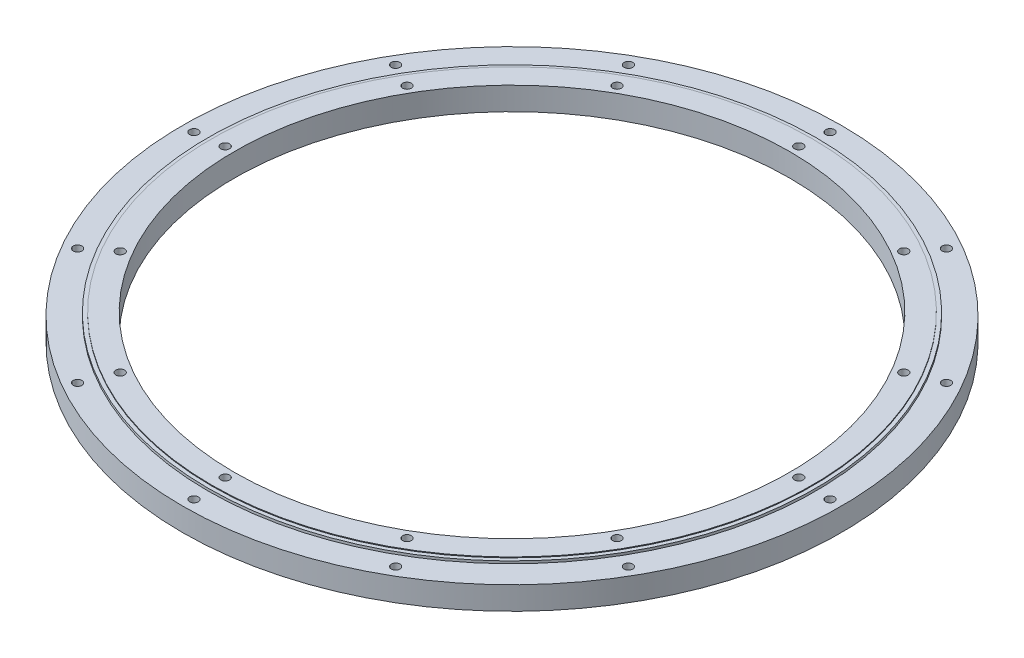
ISO-10303-21;
HEADER;
FILE_DESCRIPTION(('STEP AP214'),'2;1');
FILE_NAME('part.step','',(''),(''),'','','');
FILE_SCHEMA(('AUTOMOTIVE_DESIGN { 1 0 10303 214 1 1 1 1 }'));
ENDSEC;
DATA;
#1=APPLICATION_CONTEXT('core data for automotive mechanical design processes');
#2=APPLICATION_PROTOCOL_DEFINITION('international standard','automotive_design',2000,#1);
#3=PRODUCT_CONTEXT('',#1,'mechanical');
#4=PRODUCT('Part','Part','',(#3));
#5=PRODUCT_RELATED_PRODUCT_CATEGORY('part','',(#4));
#6=PRODUCT_DEFINITION_FORMATION('','',#4);
#7=PRODUCT_DEFINITION_CONTEXT('part definition',#1,'design');
#8=PRODUCT_DEFINITION('design','',#6,#7);
#9=PRODUCT_DEFINITION_SHAPE('','',#8);
#10=(LENGTH_UNIT() NAMED_UNIT(*) SI_UNIT(.MILLI.,.METRE.));
#11=(NAMED_UNIT(*) PLANE_ANGLE_UNIT() SI_UNIT($,.RADIAN.));
#12=(NAMED_UNIT(*) SI_UNIT($,.STERADIAN.) SOLID_ANGLE_UNIT());
#13=UNCERTAINTY_MEASURE_WITH_UNIT(LENGTH_MEASURE(1.E-05),#10,'distance_accuracy_value','');
#14=(GEOMETRIC_REPRESENTATION_CONTEXT(3) GLOBAL_UNCERTAINTY_ASSIGNED_CONTEXT((#13)) GLOBAL_UNIT_ASSIGNED_CONTEXT((#10,
#11,#12)) REPRESENTATION_CONTEXT('',''));
#15=CARTESIAN_POINT('',(0.,0.,0.));
#16=DIRECTION('',(0.,0.,1.));
#17=DIRECTION('',(1.,0.,0.));
#18=AXIS2_PLACEMENT_3D('',#15,#16,#17);
#19=CARTESIAN_POINT('',(-169.,2.,0.));
#20=DIRECTION('',(0.,1.,0.));
#21=DIRECTION('',(0.,0.,1.));
#22=AXIS2_PLACEMENT_3D('',#19,#20,#21);
#23=PLANE('',#22);
#24=CARTESIAN_POINT('',(87.2499999999999,2.,-151.121432960385));
#25=DIRECTION('',(0.,-1.,0.));
#26=DIRECTION('',(0.,0.,-1.));
#27=AXIS2_PLACEMENT_3D('',#24,#25,#26);
#28=CIRCLE('',#27,2.65000000000001);
#29=CARTESIAN_POINT('',(87.2499999999999,2.,-153.771432960385));
#30=VERTEX_POINT('',#29);
#31=EDGE_CURVE('E262',#30,#30,#28,.F.);
#32=ORIENTED_EDGE('',*,*,#31,.T.);
#33=EDGE_LOOP('',(#32));
#34=FACE_BOUND('',#33,.T.);
#35=CARTESIAN_POINT('',(151.121432960385,2.,87.2499999999999));
#36=DIRECTION('',(0.,-1.,0.));
#37=DIRECTION('',(0.,0.,-1.));
#38=AXIS2_PLACEMENT_3D('',#35,#36,#37);
#39=CIRCLE('',#38,2.64999999999999);
#40=CARTESIAN_POINT('',(151.121432960385,2.,84.6));
#41=VERTEX_POINT('',#40);
#42=EDGE_CURVE('E219',#41,#41,#39,.F.);
#43=ORIENTED_EDGE('',*,*,#42,.T.);
#44=EDGE_LOOP('',(#43));
#45=FACE_BOUND('',#44,.T.);
#46=CARTESIAN_POINT('',(0.,2.,0.));
#47=DIRECTION('',(0.,-1.,0.));
#48=DIRECTION('',(0.,0.,-1.));
#49=AXIS2_PLACEMENT_3D('',#46,#47,#48);
#50=CIRCLE('',#49,182.589);
#51=CARTESIAN_POINT('',(0.,2.,-182.589));
#52=VERTEX_POINT('',#51);
#53=EDGE_CURVE('E25',#52,#52,#50,.T.);
#54=ORIENTED_EDGE('',*,*,#53,.T.);
#55=EDGE_LOOP('',(#54));
#56=FACE_BOUND('',#55,.T.);
#57=CARTESIAN_POINT('',(0.,2.,0.));
#58=DIRECTION('',(0.,-1.,0.));
#59=DIRECTION('',(0.,0.,-1.));
#60=AXIS2_PLACEMENT_3D('',#57,#58,#59);
#61=CIRCLE('',#60,169.);
#62=CARTESIAN_POINT('',(0.,2.,-169.));
#63=VERTEX_POINT('',#62);
#64=EDGE_CURVE('E215',#63,#63,#61,.F.);
#65=ORIENTED_EDGE('',*,*,#64,.T.);
#66=EDGE_LOOP('',(#65));
#67=FACE_BOUND('',#66,.T.);
#68=CARTESIAN_POINT('',(87.2500000000001,2.,151.121432960384));
#69=DIRECTION('',(0.,-1.,0.));
#70=DIRECTION('',(0.,0.,-1.));
#71=AXIS2_PLACEMENT_3D('',#68,#69,#70);
#72=CIRCLE('',#71,2.64999999999999);
#73=CARTESIAN_POINT('',(87.2500000000001,2.,148.471432960385));
#74=VERTEX_POINT('',#73);
#75=EDGE_CURVE('E223',#74,#74,#72,.F.);
#76=ORIENTED_EDGE('',*,*,#75,.T.);
#77=EDGE_LOOP('',(#76));
#78=FACE_BOUND('',#77,.T.);
#79=CARTESIAN_POINT('',(1.0953667407042E-13,2.,174.5));
#80=DIRECTION('',(0.,-1.,0.));
#81=DIRECTION('',(0.,0.,-1.));
#82=AXIS2_PLACEMENT_3D('',#79,#80,#81);
#83=CIRCLE('',#82,2.64999999999999);
#84=CARTESIAN_POINT('',(1.0953667407042E-13,2.,171.85));
#85=VERTEX_POINT('',#84);
#86=EDGE_CURVE('E227',#85,#85,#83,.F.);
#87=ORIENTED_EDGE('',*,*,#86,.T.);
#88=EDGE_LOOP('',(#87));
#89=FACE_BOUND('',#88,.T.);
#90=CARTESIAN_POINT('',(-87.2499999999999,2.,151.121432960385));
#91=DIRECTION('',(0.,-1.,0.));
#92=DIRECTION('',(0.,0.,-1.));
#93=AXIS2_PLACEMENT_3D('',#90,#91,#92);
#94=CIRCLE('',#93,2.65000000000001);
#95=CARTESIAN_POINT('',(-87.2499999999999,2.,148.471432960385));
#96=VERTEX_POINT('',#95);
#97=EDGE_CURVE('E231',#96,#96,#94,.F.);
#98=ORIENTED_EDGE('',*,*,#97,.T.);
#99=EDGE_LOOP('',(#98));
#100=FACE_BOUND('',#99,.T.);
#101=CARTESIAN_POINT('',(-151.121432960384,2.,87.2500000000001));
#102=DIRECTION('',(0.,-1.,0.));
#103=DIRECTION('',(0.,0.,-1.));
#104=AXIS2_PLACEMENT_3D('',#101,#102,#103);
#105=CIRCLE('',#104,2.64999999999999);
#106=CARTESIAN_POINT('',(-151.121432960384,2.,84.6000000000002));
#107=VERTEX_POINT('',#106);
#108=EDGE_CURVE('E235',#107,#107,#105,.F.);
#109=ORIENTED_EDGE('',*,*,#108,.T.);
#110=EDGE_LOOP('',(#109));
#111=FACE_BOUND('',#110,.T.);
#112=CARTESIAN_POINT('',(-174.5,2.,1.77190889633515E-13));
#113=DIRECTION('',(0.,-1.,0.));
#114=DIRECTION('',(0.,0.,-1.));
#115=AXIS2_PLACEMENT_3D('',#112,#113,#114);
#116=CIRCLE('',#115,2.64999999999999);
#117=CARTESIAN_POINT('',(-174.5,2.,-2.64999999999981));
#118=VERTEX_POINT('',#117);
#119=EDGE_CURVE('E239',#118,#118,#116,.F.);
#120=ORIENTED_EDGE('',*,*,#119,.T.);
#121=EDGE_LOOP('',(#120));
#122=FACE_BOUND('',#121,.T.);
#123=CARTESIAN_POINT('',(174.5,2.,0.));
#124=DIRECTION('',(0.,-1.,0.));
#125=DIRECTION('',(0.,0.,-1.));
#126=AXIS2_PLACEMENT_3D('',#123,#124,#125);
#127=CIRCLE('',#126,2.64999999999999);
#128=CARTESIAN_POINT('',(174.5,2.,-2.65000000000003));
#129=VERTEX_POINT('',#128);
#130=EDGE_CURVE('E243',#129,#129,#127,.F.);
#131=ORIENTED_EDGE('',*,*,#130,.T.);
#132=EDGE_LOOP('',(#131));
#133=FACE_BOUND('',#132,.T.);
#134=CARTESIAN_POINT('',(0.,2.,-174.5));
#135=DIRECTION('',(0.,-1.,0.));
#136=DIRECTION('',(0.,0.,-1.));
#137=AXIS2_PLACEMENT_3D('',#134,#135,#136);
#138=CIRCLE('',#137,2.64999999999999);
#139=CARTESIAN_POINT('',(0.,2.,-177.15));
#140=VERTEX_POINT('',#139);
#141=EDGE_CURVE('E247',#140,#140,#138,.F.);
#142=ORIENTED_EDGE('',*,*,#141,.T.);
#143=EDGE_LOOP('',(#142));
#144=FACE_BOUND('',#143,.T.);
#145=CARTESIAN_POINT('',(-87.2499999999998,2.,-151.121432960385));
#146=DIRECTION('',(0.,-1.,0.));
#147=DIRECTION('',(0.,0.,-1.));
#148=AXIS2_PLACEMENT_3D('',#145,#146,#147);
#149=CIRCLE('',#148,2.65000000000001);
#150=CARTESIAN_POINT('',(-87.2499999999998,2.,-153.771432960385));
#151=VERTEX_POINT('',#150);
#152=EDGE_CURVE('E251',#151,#151,#149,.F.);
#153=ORIENTED_EDGE('',*,*,#152,.T.);
#154=EDGE_LOOP('',(#153));
#155=FACE_BOUND('',#154,.T.);
#156=CARTESIAN_POINT('',(151.121432960385,2.,-87.25));
#157=DIRECTION('',(0.,-1.,0.));
#158=DIRECTION('',(0.,0.,-1.));
#159=AXIS2_PLACEMENT_3D('',#156,#157,#158);
#160=CIRCLE('',#159,2.64999999999999);
#161=CARTESIAN_POINT('',(151.121432960385,2.,-89.9));
#162=VERTEX_POINT('',#161);
#163=EDGE_CURVE('E255',#162,#162,#160,.F.);
#164=ORIENTED_EDGE('',*,*,#163,.T.);
#165=EDGE_LOOP('',(#164));
#166=FACE_BOUND('',#165,.T.);
#167=CARTESIAN_POINT('',(-151.121432960385,2.,-87.25));
#168=DIRECTION('',(0.,-1.,0.));
#169=DIRECTION('',(0.,0.,-1.));
#170=AXIS2_PLACEMENT_3D('',#167,#168,#169);
#171=CIRCLE('',#170,2.64999999999999);
#172=CARTESIAN_POINT('',(-151.121432960385,2.,-89.8999999999999));
#173=VERTEX_POINT('',#172);
#174=EDGE_CURVE('E259',#173,#173,#171,.F.);
#175=ORIENTED_EDGE('',*,*,#174,.T.);
#176=EDGE_LOOP('',(#175));
#177=FACE_BOUND('',#176,.T.);
#178=ADVANCED_FACE('F22',(#34,#45,#56,#67,#78,#89,#100,#111,#122,#133,#144,#155,#166,#177),#23,.F.);
#179=CARTESIAN_POINT('',(0.,0.,0.));
#180=DIRECTION('',(0.,-1.,0.));
#181=DIRECTION('',(0.,0.,-1.));
#182=AXIS2_PLACEMENT_3D('',#179,#180,#181);
#183=CYLINDRICAL_SURFACE('',#182,182.589);
#184=ORIENTED_EDGE('',*,*,#53,.F.);
#185=EDGE_LOOP('',(#184));
#186=FACE_BOUND('',#185,.T.);
#187=CARTESIAN_POINT('',(0.,0.76,0.));
#188=DIRECTION('',(0.,-1.,0.));
#189=DIRECTION('',(0.,0.,-1.));
#190=AXIS2_PLACEMENT_3D('',#187,#188,#189);
#191=CIRCLE('',#190,182.589);
#192=CARTESIAN_POINT('',(0.,0.76,-182.589));
#193=VERTEX_POINT('',#192);
#194=EDGE_CURVE('E211',#193,#193,#191,.T.);
#195=ORIENTED_EDGE('',*,*,#194,.T.);
#196=EDGE_LOOP('',(#195));
#197=FACE_BOUND('',#196,.T.);
#198=ADVANCED_FACE('F273',(#186,#197),#183,.F.);
#199=CARTESIAN_POINT('',(87.2499999999999,2.,-151.121432960385));
#200=DIRECTION('',(0.,-1.,0.));
#201=DIRECTION('',(0.,0.,-1.));
#202=AXIS2_PLACEMENT_3D('',#199,#200,#201);
#203=CYLINDRICAL_SURFACE('',#202,2.65000000000001);
#204=CARTESIAN_POINT('',(87.2499999999999,16.,-151.121432960385));
#205=DIRECTION('',(0.,-1.,0.));
#206=DIRECTION('',(0.,0.,-1.));
#207=AXIS2_PLACEMENT_3D('',#204,#205,#206);
#208=CIRCLE('',#207,2.65000000000001);
#209=CARTESIAN_POINT('',(87.2499999999999,16.,-153.771432960385));
#210=VERTEX_POINT('',#209);
#211=EDGE_CURVE('E207',#210,#210,#208,.F.);
#212=ORIENTED_EDGE('',*,*,#211,.T.);
#213=EDGE_LOOP('',(#212));
#214=FACE_BOUND('',#213,.T.);
#215=ORIENTED_EDGE('',*,*,#31,.F.);
#216=EDGE_LOOP('',(#215));
#217=FACE_BOUND('',#216,.T.);
#218=ADVANCED_FACE('F276',(#214,#217),#203,.F.);
#219=CARTESIAN_POINT('',(-151.121432960385,2.,-87.25));
#220=DIRECTION('',(0.,-1.,0.));
#221=DIRECTION('',(0.,0.,-1.));
#222=AXIS2_PLACEMENT_3D('',#219,#220,#221);
#223=CYLINDRICAL_SURFACE('',#222,2.64999999999999);
#224=CARTESIAN_POINT('',(-151.121432960385,16.,-87.25));
#225=DIRECTION('',(0.,-1.,0.));
#226=DIRECTION('',(0.,0.,-1.));
#227=AXIS2_PLACEMENT_3D('',#224,#225,#226);
#228=CIRCLE('',#227,2.64999999999999);
#229=CARTESIAN_POINT('',(-151.121432960385,16.,-89.8999999999999));
#230=VERTEX_POINT('',#229);
#231=EDGE_CURVE('E203',#230,#230,#228,.F.);
#232=ORIENTED_EDGE('',*,*,#231,.T.);
#233=EDGE_LOOP('',(#232));
#234=FACE_BOUND('',#233,.T.);
#235=ORIENTED_EDGE('',*,*,#174,.F.);
#236=EDGE_LOOP('',(#235));
#237=FACE_BOUND('',#236,.T.);
#238=ADVANCED_FACE('F416',(#234,#237),#223,.F.);
#239=CARTESIAN_POINT('',(151.121432960385,2.,-87.25));
#240=DIRECTION('',(0.,-1.,0.));
#241=DIRECTION('',(0.,0.,-1.));
#242=AXIS2_PLACEMENT_3D('',#239,#240,#241);
#243=CYLINDRICAL_SURFACE('',#242,2.64999999999999);
#244=CARTESIAN_POINT('',(151.121432960385,16.,-87.25));
#245=DIRECTION('',(0.,-1.,0.));
#246=DIRECTION('',(0.,0.,-1.));
#247=AXIS2_PLACEMENT_3D('',#244,#245,#246);
#248=CIRCLE('',#247,2.64999999999999);
#249=CARTESIAN_POINT('',(151.121432960385,16.,-89.9));
#250=VERTEX_POINT('',#249);
#251=EDGE_CURVE('E199',#250,#250,#248,.F.);
#252=ORIENTED_EDGE('',*,*,#251,.T.);
#253=EDGE_LOOP('',(#252));
#254=FACE_BOUND('',#253,.T.);
#255=ORIENTED_EDGE('',*,*,#163,.F.);
#256=EDGE_LOOP('',(#255));
#257=FACE_BOUND('',#256,.T.);
#258=ADVANCED_FACE('F412',(#254,#257),#243,.F.);
#259=CARTESIAN_POINT('',(-87.2499999999998,2.,-151.121432960385));
#260=DIRECTION('',(0.,-1.,0.));
#261=DIRECTION('',(0.,0.,-1.));
#262=AXIS2_PLACEMENT_3D('',#259,#260,#261);
#263=CYLINDRICAL_SURFACE('',#262,2.65000000000001);
#264=CARTESIAN_POINT('',(-87.2499999999998,16.,-151.121432960385));
#265=DIRECTION('',(0.,-1.,0.));
#266=DIRECTION('',(0.,0.,-1.));
#267=AXIS2_PLACEMENT_3D('',#264,#265,#266);
#268=CIRCLE('',#267,2.65000000000001);
#269=CARTESIAN_POINT('',(-87.2499999999998,16.,-153.771432960385));
#270=VERTEX_POINT('',#269);
#271=EDGE_CURVE('E195',#270,#270,#268,.F.);
#272=ORIENTED_EDGE('',*,*,#271,.T.);
#273=EDGE_LOOP('',(#272));
#274=FACE_BOUND('',#273,.T.);
#275=ORIENTED_EDGE('',*,*,#152,.F.);
#276=EDGE_LOOP('',(#275));
#277=FACE_BOUND('',#276,.T.);
#278=ADVANCED_FACE('F415',(#274,#277),#263,.F.);
#279=CARTESIAN_POINT('',(0.,2.,-174.5));
#280=DIRECTION('',(0.,-1.,0.));
#281=DIRECTION('',(0.,0.,-1.));
#282=AXIS2_PLACEMENT_3D('',#279,#280,#281);
#283=CYLINDRICAL_SURFACE('',#282,2.64999999999999);
#284=CARTESIAN_POINT('',(0.,16.,-174.5));
#285=DIRECTION('',(0.,-1.,0.));
#286=DIRECTION('',(0.,0.,-1.));
#287=AXIS2_PLACEMENT_3D('',#284,#285,#286);
#288=CIRCLE('',#287,2.64999999999999);
#289=CARTESIAN_POINT('',(0.,16.,-177.15));
#290=VERTEX_POINT('',#289);
#291=EDGE_CURVE('E191',#290,#290,#288,.F.);
#292=ORIENTED_EDGE('',*,*,#291,.T.);
#293=EDGE_LOOP('',(#292));
#294=FACE_BOUND('',#293,.T.);
#295=ORIENTED_EDGE('',*,*,#141,.F.);
#296=EDGE_LOOP('',(#295));
#297=FACE_BOUND('',#296,.T.);
#298=ADVANCED_FACE('F435',(#294,#297),#283,.F.);
#299=CARTESIAN_POINT('',(174.5,2.,0.));
#300=DIRECTION('',(0.,-1.,0.));
#301=DIRECTION('',(0.,0.,-1.));
#302=AXIS2_PLACEMENT_3D('',#299,#300,#301);
#303=CYLINDRICAL_SURFACE('',#302,2.64999999999999);
#304=CARTESIAN_POINT('',(174.5,16.,0.));
#305=DIRECTION('',(0.,-1.,0.));
#306=DIRECTION('',(0.,0.,-1.));
#307=AXIS2_PLACEMENT_3D('',#304,#305,#306);
#308=CIRCLE('',#307,2.64999999999999);
#309=CARTESIAN_POINT('',(174.5,16.,-2.65000000000003));
#310=VERTEX_POINT('',#309);
#311=EDGE_CURVE('E187',#310,#310,#308,.F.);
#312=ORIENTED_EDGE('',*,*,#311,.T.);
#313=EDGE_LOOP('',(#312));
#314=FACE_BOUND('',#313,.T.);
#315=ORIENTED_EDGE('',*,*,#130,.F.);
#316=EDGE_LOOP('',(#315));
#317=FACE_BOUND('',#316,.T.);
#318=ADVANCED_FACE('F432',(#314,#317),#303,.F.);
#319=CARTESIAN_POINT('',(-174.5,2.,1.77190889633515E-13));
#320=DIRECTION('',(0.,-1.,0.));
#321=DIRECTION('',(0.,0.,-1.));
#322=AXIS2_PLACEMENT_3D('',#319,#320,#321);
#323=CYLINDRICAL_SURFACE('',#322,2.64999999999999);
#324=CARTESIAN_POINT('',(-174.5,16.,1.77190889633515E-13));
#325=DIRECTION('',(0.,-1.,0.));
#326=DIRECTION('',(0.,0.,-1.));
#327=AXIS2_PLACEMENT_3D('',#324,#325,#326);
#328=CIRCLE('',#327,2.64999999999999);
#329=CARTESIAN_POINT('',(-174.5,16.,-2.64999999999981));
#330=VERTEX_POINT('',#329);
#331=EDGE_CURVE('E183',#330,#330,#328,.F.);
#332=ORIENTED_EDGE('',*,*,#331,.T.);
#333=EDGE_LOOP('',(#332));
#334=FACE_BOUND('',#333,.T.);
#335=ORIENTED_EDGE('',*,*,#119,.F.);
#336=EDGE_LOOP('',(#335));
#337=FACE_BOUND('',#336,.T.);
#338=ADVANCED_FACE('F434',(#334,#337),#323,.F.);
#339=CARTESIAN_POINT('',(-151.121432960384,2.,87.2500000000001));
#340=DIRECTION('',(0.,-1.,0.));
#341=DIRECTION('',(0.,0.,-1.));
#342=AXIS2_PLACEMENT_3D('',#339,#340,#341);
#343=CYLINDRICAL_SURFACE('',#342,2.64999999999999);
#344=CARTESIAN_POINT('',(-151.121432960384,16.,87.2500000000001));
#345=DIRECTION('',(0.,-1.,0.));
#346=DIRECTION('',(0.,0.,-1.));
#347=AXIS2_PLACEMENT_3D('',#344,#345,#346);
#348=CIRCLE('',#347,2.64999999999999);
#349=CARTESIAN_POINT('',(-151.121432960384,16.,84.6000000000002));
#350=VERTEX_POINT('',#349);
#351=EDGE_CURVE('E179',#350,#350,#348,.F.);
#352=ORIENTED_EDGE('',*,*,#351,.T.);
#353=EDGE_LOOP('',(#352));
#354=FACE_BOUND('',#353,.T.);
#355=ORIENTED_EDGE('',*,*,#108,.F.);
#356=EDGE_LOOP('',(#355));
#357=FACE_BOUND('',#356,.T.);
#358=ADVANCED_FACE('F459',(#354,#357),#343,.F.);
#359=CARTESIAN_POINT('',(-87.2499999999999,2.,151.121432960385));
#360=DIRECTION('',(0.,-1.,0.));
#361=DIRECTION('',(0.,0.,-1.));
#362=AXIS2_PLACEMENT_3D('',#359,#360,#361);
#363=CYLINDRICAL_SURFACE('',#362,2.65000000000001);
#364=CARTESIAN_POINT('',(-87.2499999999999,16.,151.121432960385));
#365=DIRECTION('',(0.,-1.,0.));
#366=DIRECTION('',(0.,0.,-1.));
#367=AXIS2_PLACEMENT_3D('',#364,#365,#366);
#368=CIRCLE('',#367,2.65000000000001);
#369=CARTESIAN_POINT('',(-87.2499999999999,16.,148.471432960385));
#370=VERTEX_POINT('',#369);
#371=EDGE_CURVE('E175',#370,#370,#368,.F.);
#372=ORIENTED_EDGE('',*,*,#371,.T.);
#373=EDGE_LOOP('',(#372));
#374=FACE_BOUND('',#373,.T.);
#375=ORIENTED_EDGE('',*,*,#97,.F.);
#376=EDGE_LOOP('',(#375));
#377=FACE_BOUND('',#376,.T.);
#378=ADVANCED_FACE('F455',(#374,#377),#363,.F.);
#379=CARTESIAN_POINT('',(1.0953667407042E-13,2.,174.5));
#380=DIRECTION('',(0.,-1.,0.));
#381=DIRECTION('',(0.,0.,-1.));
#382=AXIS2_PLACEMENT_3D('',#379,#380,#381);
#383=CYLINDRICAL_SURFACE('',#382,2.64999999999999);
#384=CARTESIAN_POINT('',(1.0953667407042E-13,16.,174.5));
#385=DIRECTION('',(0.,-1.,0.));
#386=DIRECTION('',(0.,0.,-1.));
#387=AXIS2_PLACEMENT_3D('',#384,#385,#386);
#388=CIRCLE('',#387,2.64999999999999);
#389=CARTESIAN_POINT('',(1.0953667407042E-13,16.,171.85));
#390=VERTEX_POINT('',#389);
#391=EDGE_CURVE('E171',#390,#390,#388,.F.);
#392=ORIENTED_EDGE('',*,*,#391,.T.);
#393=EDGE_LOOP('',(#392));
#394=FACE_BOUND('',#393,.T.);
#395=ORIENTED_EDGE('',*,*,#86,.F.);
#396=EDGE_LOOP('',(#395));
#397=FACE_BOUND('',#396,.T.);
#398=ADVANCED_FACE('F458',(#394,#397),#383,.F.);
#399=CARTESIAN_POINT('',(87.2500000000001,2.,151.121432960384));
#400=DIRECTION('',(0.,-1.,0.));
#401=DIRECTION('',(0.,0.,-1.));
#402=AXIS2_PLACEMENT_3D('',#399,#400,#401);
#403=CYLINDRICAL_SURFACE('',#402,2.64999999999999);
#404=CARTESIAN_POINT('',(87.2500000000001,16.,151.121432960384));
#405=DIRECTION('',(0.,-1.,0.));
#406=DIRECTION('',(0.,0.,-1.));
#407=AXIS2_PLACEMENT_3D('',#404,#405,#406);
#408=CIRCLE('',#407,2.64999999999999);
#409=CARTESIAN_POINT('',(87.2500000000001,16.,148.471432960385));
#410=VERTEX_POINT('',#409);
#411=EDGE_CURVE('E167',#410,#410,#408,.F.);
#412=ORIENTED_EDGE('',*,*,#411,.T.);
#413=EDGE_LOOP('',(#412));
#414=FACE_BOUND('',#413,.T.);
#415=ORIENTED_EDGE('',*,*,#75,.F.);
#416=EDGE_LOOP('',(#415));
#417=FACE_BOUND('',#416,.T.);
#418=ADVANCED_FACE('F425',(#414,#417),#403,.F.);
#419=CARTESIAN_POINT('',(151.121432960385,2.,87.2499999999999));
#420=DIRECTION('',(0.,-1.,0.));
#421=DIRECTION('',(0.,0.,-1.));
#422=AXIS2_PLACEMENT_3D('',#419,#420,#421);
#423=CYLINDRICAL_SURFACE('',#422,2.64999999999999);
#424=CARTESIAN_POINT('',(151.121432960385,16.,87.2499999999999));
#425=DIRECTION('',(0.,-1.,0.));
#426=DIRECTION('',(0.,0.,-1.));
#427=AXIS2_PLACEMENT_3D('',#424,#425,#426);
#428=CIRCLE('',#427,2.64999999999999);
#429=CARTESIAN_POINT('',(151.121432960385,16.,84.6));
#430=VERTEX_POINT('',#429);
#431=EDGE_CURVE('E163',#430,#430,#428,.F.);
#432=ORIENTED_EDGE('',*,*,#431,.T.);
#433=EDGE_LOOP('',(#432));
#434=FACE_BOUND('',#433,.T.);
#435=ORIENTED_EDGE('',*,*,#42,.F.);
#436=EDGE_LOOP('',(#435));
#437=FACE_BOUND('',#436,.T.);
#438=ADVANCED_FACE('F293',(#434,#437),#423,.F.);
#439=CARTESIAN_POINT('',(0.,0.,0.));
#440=DIRECTION('',(0.,-1.,0.));
#441=DIRECTION('',(0.,0.,-1.));
#442=AXIS2_PLACEMENT_3D('',#439,#440,#441);
#443=CYLINDRICAL_SURFACE('',#442,169.);
#444=CARTESIAN_POINT('',(0.,16.,0.));
#445=DIRECTION('',(0.,-1.,0.));
#446=DIRECTION('',(0.,0.,-1.));
#447=AXIS2_PLACEMENT_3D('',#444,#445,#446);
#448=CIRCLE('',#447,169.);
#449=CARTESIAN_POINT('',(0.,16.,-169.));
#450=VERTEX_POINT('',#449);
#451=EDGE_CURVE('E159',#450,#450,#448,.F.);
#452=ORIENTED_EDGE('',*,*,#451,.T.);
#453=EDGE_LOOP('',(#452));
#454=FACE_BOUND('',#453,.T.);
#455=ORIENTED_EDGE('',*,*,#64,.F.);
#456=EDGE_LOOP('',(#455));
#457=FACE_BOUND('',#456,.T.);
#458=ADVANCED_FACE('F282',(#454,#457),#443,.F.);
#459=CARTESIAN_POINT('',(-182.589,0.76,0.));
#460=DIRECTION('',(0.,1.,0.));
#461=DIRECTION('',(0.,0.,1.));
#462=AXIS2_PLACEMENT_3D('',#459,#460,#461);
#463=PLANE('',#462);
#464=CARTESIAN_POINT('',(0.,0.759999999999999,0.));
#465=DIRECTION('',(0.,-1.,0.));
#466=DIRECTION('',(0.,0.,-1.));
#467=AXIS2_PLACEMENT_3D('',#464,#465,#466);
#468=CIRCLE('',#467,184.835799999991);
#469=CARTESIAN_POINT('',(0.,0.759999999999999,-184.835799999991));
#470=VERTEX_POINT('',#469);
#471=EDGE_CURVE('E155',#470,#470,#468,.T.);
#472=ORIENTED_EDGE('',*,*,#471,.T.);
#473=EDGE_LOOP('',(#472));
#474=FACE_BOUND('',#473,.T.);
#475=ORIENTED_EDGE('',*,*,#194,.F.);
#476=EDGE_LOOP('',(#475));
#477=FACE_BOUND('',#476,.T.);
#478=ADVANCED_FACE('F279',(#474,#477),#463,.F.);
#479=CARTESIAN_POINT('',(-169.,16.,0.));
#480=DIRECTION('',(0.,-1.,0.));
#481=DIRECTION('',(0.,0.,-1.));
#482=AXIS2_PLACEMENT_3D('',#479,#480,#481);
#483=PLANE('',#482);
#484=ORIENTED_EDGE('',*,*,#451,.F.);
#485=EDGE_LOOP('',(#484));
#486=FACE_BOUND('',#485,.T.);
#487=CARTESIAN_POINT('',(0.,16.,0.));
#488=DIRECTION('',(0.,-1.,0.));
#489=DIRECTION('',(0.,0.,-1.));
#490=AXIS2_PLACEMENT_3D('',#487,#488,#489);
#491=CIRCLE('',#490,182.589);
#492=CARTESIAN_POINT('',(0.,16.,-182.589));
#493=VERTEX_POINT('',#492);
#494=EDGE_CURVE('E152',#493,#493,#491,.T.);
#495=ORIENTED_EDGE('',*,*,#494,.F.);
#496=EDGE_LOOP('',(#495));
#497=FACE_BOUND('',#496,.T.);
#498=ORIENTED_EDGE('',*,*,#431,.F.);
#499=EDGE_LOOP('',(#498));
#500=FACE_BOUND('',#499,.T.);
#501=ORIENTED_EDGE('',*,*,#411,.F.);
#502=EDGE_LOOP('',(#501));
#503=FACE_BOUND('',#502,.T.);
#504=ORIENTED_EDGE('',*,*,#391,.F.);
#505=EDGE_LOOP('',(#504));
#506=FACE_BOUND('',#505,.T.);
#507=ORIENTED_EDGE('',*,*,#371,.F.);
#508=EDGE_LOOP('',(#507));
#509=FACE_BOUND('',#508,.T.);
#510=ORIENTED_EDGE('',*,*,#351,.F.);
#511=EDGE_LOOP('',(#510));
#512=FACE_BOUND('',#511,.T.);
#513=ORIENTED_EDGE('',*,*,#331,.F.);
#514=EDGE_LOOP('',(#513));
#515=FACE_BOUND('',#514,.T.);
#516=ORIENTED_EDGE('',*,*,#311,.F.);
#517=EDGE_LOOP('',(#516));
#518=FACE_BOUND('',#517,.T.);
#519=ORIENTED_EDGE('',*,*,#291,.F.);
#520=EDGE_LOOP('',(#519));
#521=FACE_BOUND('',#520,.T.);
#522=ORIENTED_EDGE('',*,*,#271,.F.);
#523=EDGE_LOOP('',(#522));
#524=FACE_BOUND('',#523,.T.);
#525=ORIENTED_EDGE('',*,*,#251,.F.);
#526=EDGE_LOOP('',(#525));
#527=FACE_BOUND('',#526,.T.);
#528=ORIENTED_EDGE('',*,*,#231,.F.);
#529=EDGE_LOOP('',(#528));
#530=FACE_BOUND('',#529,.T.);
#531=ORIENTED_EDGE('',*,*,#211,.F.);
#532=EDGE_LOOP('',(#531));
#533=FACE_BOUND('',#532,.T.);
#534=ADVANCED_FACE('F281',(#486,#497,#500,#503,#506,#509,#512,#515,#518,#521,#524,#527,#530,
#533),#483,.F.);
#535=CARTESIAN_POINT('',(0.,0.,0.));
#536=DIRECTION('',(0.,-1.,0.));
#537=DIRECTION('',(0.,0.,-1.));
#538=AXIS2_PLACEMENT_3D('',#535,#536,#537);
#539=CYLINDRICAL_SURFACE('',#538,184.835799999991);
#540=ORIENTED_EDGE('',*,*,#471,.F.);
#541=EDGE_LOOP('',(#540));
#542=FACE_BOUND('',#541,.T.);
#543=CARTESIAN_POINT('',(0.,0.,0.));
#544=DIRECTION('',(0.,-1.,0.));
#545=DIRECTION('',(0.,0.,-1.));
#546=AXIS2_PLACEMENT_3D('',#543,#544,#545);
#547=CIRCLE('',#546,184.835799999991);
#548=CARTESIAN_POINT('',(0.,0.,-184.835799999991));
#549=VERTEX_POINT('',#548);
#550=EDGE_CURVE('E148',#549,#549,#547,.T.);
#551=ORIENTED_EDGE('',*,*,#550,.T.);
#552=EDGE_LOOP('',(#551));
#553=FACE_BOUND('',#552,.T.);
#554=ADVANCED_FACE('F289',(#542,#553),#539,.F.);
#555=CARTESIAN_POINT('',(0.,0.,0.));
#556=DIRECTION('',(0.,-1.,0.));
#557=DIRECTION('',(0.,0.,-1.));
#558=AXIS2_PLACEMENT_3D('',#555,#556,#557);
#559=CYLINDRICAL_SURFACE('',#558,182.589);
#560=CARTESIAN_POINT('',(0.,15.494,0.));
#561=DIRECTION('',(0.,-1.,0.));
#562=DIRECTION('',(0.,0.,-1.));
#563=AXIS2_PLACEMENT_3D('',#560,#561,#562);
#564=CIRCLE('',#563,182.589);
#565=CARTESIAN_POINT('',(0.,15.494,-182.589));
#566=VERTEX_POINT('',#565);
#567=EDGE_CURVE('E144',#566,#566,#564,.F.);
#568=ORIENTED_EDGE('',*,*,#567,.T.);
#569=EDGE_LOOP('',(#568));
#570=FACE_BOUND('',#569,.T.);
#571=ORIENTED_EDGE('',*,*,#494,.T.);
#572=EDGE_LOOP('',(#571));
#573=FACE_BOUND('',#572,.T.);
#574=ADVANCED_FACE('F365',(#570,#573),#559,.T.);
#575=CARTESIAN_POINT('',(-200.5,0.,0.));
#576=DIRECTION('',(0.,1.,0.));
#577=DIRECTION('',(0.,0.,1.));
#578=AXIS2_PLACEMENT_3D('',#575,#576,#577);
#579=PLANE('',#578);
#580=CARTESIAN_POINT('',(96.75,0.,167.575915632289));
#581=DIRECTION('',(0.,-1.,0.));
#582=DIRECTION('',(0.,0.,-1.));
#583=AXIS2_PLACEMENT_3D('',#580,#581,#582);
#584=CIRCLE('',#583,2.64999999999999);
#585=CARTESIAN_POINT('',(96.75,0.,164.925915632289));
#586=VERTEX_POINT('',#585);
#587=EDGE_CURVE('E140',#586,#586,#584,.F.);
#588=ORIENTED_EDGE('',*,*,#587,.T.);
#589=EDGE_LOOP('',(#588));
#590=FACE_BOUND('',#589,.T.);
#591=CARTESIAN_POINT('',(0.,0.,193.5));
#592=DIRECTION('',(0.,-1.,0.));
#593=DIRECTION('',(0.,0.,-1.));
#594=AXIS2_PLACEMENT_3D('',#591,#592,#593);
#595=CIRCLE('',#594,2.64999999999999);
#596=CARTESIAN_POINT('',(0.,0.,190.85));
#597=VERTEX_POINT('',#596);
#598=EDGE_CURVE('E136',#597,#597,#595,.F.);
#599=ORIENTED_EDGE('',*,*,#598,.T.);
#600=EDGE_LOOP('',(#599));
#601=FACE_BOUND('',#600,.T.);
#602=CARTESIAN_POINT('',(193.5,0.,0.));
#603=DIRECTION('',(0.,-1.,0.));
#604=DIRECTION('',(0.,0.,-1.));
#605=AXIS2_PLACEMENT_3D('',#602,#603,#604);
#606=CIRCLE('',#605,2.64999999999999);
#607=CARTESIAN_POINT('',(193.5,0.,-2.64999999999989));
#608=VERTEX_POINT('',#607);
#609=EDGE_CURVE('E124',#608,#608,#606,.F.);
#610=ORIENTED_EDGE('',*,*,#609,.T.);
#611=EDGE_LOOP('',(#610));
#612=FACE_BOUND('',#611,.T.);
#613=CARTESIAN_POINT('',(0.,0.,0.));
#614=DIRECTION('',(0.,-1.,0.));
#615=DIRECTION('',(0.,0.,-1.));
#616=AXIS2_PLACEMENT_3D('',#613,#614,#615);
#617=CIRCLE('',#616,200.5);
#618=CARTESIAN_POINT('',(0.,0.,-200.5));
#619=VERTEX_POINT('',#618);
#620=EDGE_CURVE('E92',#619,#619,#617,.F.);
#621=ORIENTED_EDGE('',*,*,#620,.F.);
#622=EDGE_LOOP('',(#621));
#623=FACE_BOUND('',#622,.T.);
#624=ORIENTED_EDGE('',*,*,#550,.F.);
#625=EDGE_LOOP('',(#624));
#626=FACE_BOUND('',#625,.T.);
#627=CARTESIAN_POINT('',(-167.575915632289,0.,96.7499999999999));
#628=DIRECTION('',(0.,-1.,0.));
#629=DIRECTION('',(0.,0.,-1.));
#630=AXIS2_PLACEMENT_3D('',#627,#628,#629);
#631=CIRCLE('',#630,2.64999999999999);
#632=CARTESIAN_POINT('',(-167.575915632289,0.,94.1));
#633=VERTEX_POINT('',#632);
#634=EDGE_CURVE('E96',#633,#633,#631,.F.);
#635=ORIENTED_EDGE('',*,*,#634,.T.);
#636=EDGE_LOOP('',(#635));
#637=FACE_BOUND('',#636,.T.);
#638=CARTESIAN_POINT('',(-193.5,0.,0.));
#639=DIRECTION('',(0.,-1.,0.));
#640=DIRECTION('',(0.,0.,-1.));
#641=AXIS2_PLACEMENT_3D('',#638,#639,#640);
#642=CIRCLE('',#641,2.64999999999999);
#643=CARTESIAN_POINT('',(-193.5,0.,-2.65000000000004));
#644=VERTEX_POINT('',#643);
#645=EDGE_CURVE('E100',#644,#644,#642,.F.);
#646=ORIENTED_EDGE('',*,*,#645,.T.);
#647=EDGE_LOOP('',(#646));
#648=FACE_BOUND('',#647,.T.);
#649=CARTESIAN_POINT('',(-167.575915632289,0.,-96.75));
#650=DIRECTION('',(0.,-1.,0.));
#651=DIRECTION('',(0.,0.,-1.));
#652=AXIS2_PLACEMENT_3D('',#649,#650,#651);
#653=CIRCLE('',#652,2.64999999999999);
#654=CARTESIAN_POINT('',(-167.575915632289,0.,-99.4));
#655=VERTEX_POINT('',#654);
#656=EDGE_CURVE('E104',#655,#655,#653,.F.);
#657=ORIENTED_EDGE('',*,*,#656,.T.);
#658=EDGE_LOOP('',(#657));
#659=FACE_BOUND('',#658,.T.);
#660=CARTESIAN_POINT('',(-96.75,0.,-167.575915632289));
#661=DIRECTION('',(0.,-1.,0.));
#662=DIRECTION('',(0.,0.,-1.));
#663=AXIS2_PLACEMENT_3D('',#660,#661,#662);
#664=CIRCLE('',#663,2.65000000000001);
#665=CARTESIAN_POINT('',(-96.75,0.,-170.225915632289));
#666=VERTEX_POINT('',#665);
#667=EDGE_CURVE('E108',#666,#666,#664,.F.);
#668=ORIENTED_EDGE('',*,*,#667,.T.);
#669=EDGE_LOOP('',(#668));
#670=FACE_BOUND('',#669,.T.);
#671=CARTESIAN_POINT('',(96.75,0.,-167.575915632289));
#672=DIRECTION('',(0.,-1.,0.));
#673=DIRECTION('',(0.,0.,-1.));
#674=AXIS2_PLACEMENT_3D('',#671,#672,#673);
#675=CIRCLE('',#674,2.65000000000001);
#676=CARTESIAN_POINT('',(96.75,0.,-170.225915632289));
#677=VERTEX_POINT('',#676);
#678=EDGE_CURVE('E112',#677,#677,#675,.F.);
#679=ORIENTED_EDGE('',*,*,#678,.T.);
#680=EDGE_LOOP('',(#679));
#681=FACE_BOUND('',#680,.T.);
#682=CARTESIAN_POINT('',(0.,0.,-193.5));
#683=DIRECTION('',(0.,-1.,0.));
#684=DIRECTION('',(0.,0.,-1.));
#685=AXIS2_PLACEMENT_3D('',#682,#683,#684);
#686=CIRCLE('',#685,2.64999999999999);
#687=CARTESIAN_POINT('',(0.,0.,-196.15));
#688=VERTEX_POINT('',#687);
#689=EDGE_CURVE('E116',#688,#688,#686,.F.);
#690=ORIENTED_EDGE('',*,*,#689,.T.);
#691=EDGE_LOOP('',(#690));
#692=FACE_BOUND('',#691,.T.);
#693=CARTESIAN_POINT('',(167.575915632289,0.,-96.75));
#694=DIRECTION('',(0.,-1.,0.));
#695=DIRECTION('',(0.,0.,-1.));
#696=AXIS2_PLACEMENT_3D('',#693,#694,#695);
#697=CIRCLE('',#696,2.64999999999999);
#698=CARTESIAN_POINT('',(167.575915632289,0.,-99.4));
#699=VERTEX_POINT('',#698);
#700=EDGE_CURVE('E120',#699,#699,#697,.F.);
#701=ORIENTED_EDGE('',*,*,#700,.T.);
#702=EDGE_LOOP('',(#701));
#703=FACE_BOUND('',#702,.T.);
#704=CARTESIAN_POINT('',(167.575915632289,0.,96.75));
#705=DIRECTION('',(0.,-1.,0.));
#706=DIRECTION('',(0.,0.,-1.));
#707=AXIS2_PLACEMENT_3D('',#704,#705,#706);
#708=CIRCLE('',#707,2.64999999999999);
#709=CARTESIAN_POINT('',(167.575915632289,0.,94.1));
#710=VERTEX_POINT('',#709);
#711=EDGE_CURVE('E128',#710,#710,#708,.F.);
#712=ORIENTED_EDGE('',*,*,#711,.T.);
#713=EDGE_LOOP('',(#712));
#714=FACE_BOUND('',#713,.T.);
#715=CARTESIAN_POINT('',(-96.7500000000001,0.,167.575915632289));
#716=DIRECTION('',(0.,-1.,0.));
#717=DIRECTION('',(0.,0.,-1.));
#718=AXIS2_PLACEMENT_3D('',#715,#716,#717);
#719=CIRCLE('',#718,2.65000000000001);
#720=CARTESIAN_POINT('',(-96.7500000000001,0.,164.925915632289));
#721=VERTEX_POINT('',#720);
#722=EDGE_CURVE('E132',#721,#721,#719,.F.);
#723=ORIENTED_EDGE('',*,*,#722,.T.);
#724=EDGE_LOOP('',(#723));
#725=FACE_BOUND('',#724,.T.);
#726=ADVANCED_FACE('F361',(#590,#601,#612,#623,#626,#637,#648,#659,#670,#681,#692,#703,#714,
#725),#579,.F.);
#727=CARTESIAN_POINT('',(-182.589,15.494,0.));
#728=DIRECTION('',(0.,-1.,0.));
#729=DIRECTION('',(0.,0.,-1.));
#730=AXIS2_PLACEMENT_3D('',#727,#728,#729);
#731=PLANE('',#730);
#732=ORIENTED_EDGE('',*,*,#567,.F.);
#733=EDGE_LOOP('',(#732));
#734=FACE_BOUND('',#733,.T.);
#735=CARTESIAN_POINT('',(0.,15.494,0.));
#736=DIRECTION('',(0.,-1.,0.));
#737=DIRECTION('',(0.,0.,-1.));
#738=AXIS2_PLACEMENT_3D('',#735,#736,#737);
#739=CIRCLE('',#738,184.835799999991);
#740=CARTESIAN_POINT('',(0.,15.494,-184.835799999991));
#741=VERTEX_POINT('',#740);
#742=EDGE_CURVE('E89',#741,#741,#739,.T.);
#743=ORIENTED_EDGE('',*,*,#742,.F.);
#744=EDGE_LOOP('',(#743));
#745=FACE_BOUND('',#744,.T.);
#746=ADVANCED_FACE('F357',(#734,#745),#731,.F.);
#747=CARTESIAN_POINT('',(96.75,0.,167.575915632289));
#748=DIRECTION('',(0.,-1.,0.));
#749=DIRECTION('',(0.,0.,-1.));
#750=AXIS2_PLACEMENT_3D('',#747,#748,#749);
#751=CYLINDRICAL_SURFACE('',#750,2.64999999999999);
#752=CARTESIAN_POINT('',(96.75,14.,167.575915632289));
#753=DIRECTION('',(0.,-1.,0.));
#754=DIRECTION('',(0.,0.,-1.));
#755=AXIS2_PLACEMENT_3D('',#752,#753,#754);
#756=CIRCLE('',#755,2.64999999999999);
#757=CARTESIAN_POINT('',(96.75,14.,164.925915632289));
#758=VERTEX_POINT('',#757);
#759=EDGE_CURVE('E85',#758,#758,#756,.F.);
#760=ORIENTED_EDGE('',*,*,#759,.T.);
#761=EDGE_LOOP('',(#760));
#762=FACE_BOUND('',#761,.T.);
#763=ORIENTED_EDGE('',*,*,#587,.F.);
#764=EDGE_LOOP('',(#763));
#765=FACE_BOUND('',#764,.T.);
#766=ADVANCED_FACE('F353',(#762,#765),#751,.F.);
#767=CARTESIAN_POINT('',(0.,0.,193.5));
#768=DIRECTION('',(0.,-1.,0.));
#769=DIRECTION('',(0.,0.,-1.));
#770=AXIS2_PLACEMENT_3D('',#767,#768,#769);
#771=CYLINDRICAL_SURFACE('',#770,2.64999999999999);
#772=CARTESIAN_POINT('',(0.,14.,193.5));
#773=DIRECTION('',(0.,-1.,0.));
#774=DIRECTION('',(0.,0.,-1.));
#775=AXIS2_PLACEMENT_3D('',#772,#773,#774);
#776=CIRCLE('',#775,2.64999999999999);
#777=CARTESIAN_POINT('',(0.,14.,190.85));
#778=VERTEX_POINT('',#777);
#779=EDGE_CURVE('E81',#778,#778,#776,.F.);
#780=ORIENTED_EDGE('',*,*,#779,.T.);
#781=EDGE_LOOP('',(#780));
#782=FACE_BOUND('',#781,.T.);
#783=ORIENTED_EDGE('',*,*,#598,.F.);
#784=EDGE_LOOP('',(#783));
#785=FACE_BOUND('',#784,.T.);
#786=ADVANCED_FACE('F349',(#782,#785),#771,.F.);
#787=CARTESIAN_POINT('',(-96.7500000000001,0.,167.575915632289));
#788=DIRECTION('',(0.,-1.,0.));
#789=DIRECTION('',(0.,0.,-1.));
#790=AXIS2_PLACEMENT_3D('',#787,#788,#789);
#791=CYLINDRICAL_SURFACE('',#790,2.65000000000001);
#792=CARTESIAN_POINT('',(-96.7500000000001,14.,167.575915632289));
#793=DIRECTION('',(0.,-1.,0.));
#794=DIRECTION('',(0.,0.,-1.));
#795=AXIS2_PLACEMENT_3D('',#792,#793,#794);
#796=CIRCLE('',#795,2.65000000000001);
#797=CARTESIAN_POINT('',(-96.7500000000001,14.,164.925915632289));
#798=VERTEX_POINT('',#797);
#799=EDGE_CURVE('E77',#798,#798,#796,.F.);
#800=ORIENTED_EDGE('',*,*,#799,.T.);
#801=EDGE_LOOP('',(#800));
#802=FACE_BOUND('',#801,.T.);
#803=ORIENTED_EDGE('',*,*,#722,.F.);
#804=EDGE_LOOP('',(#803));
#805=FACE_BOUND('',#804,.T.);
#806=ADVANCED_FACE('F345',(#802,#805),#791,.F.);
#807=CARTESIAN_POINT('',(167.575915632289,0.,96.75));
#808=DIRECTION('',(0.,-1.,0.));
#809=DIRECTION('',(0.,0.,-1.));
#810=AXIS2_PLACEMENT_3D('',#807,#808,#809);
#811=CYLINDRICAL_SURFACE('',#810,2.64999999999999);
#812=CARTESIAN_POINT('',(167.575915632289,14.,96.75));
#813=DIRECTION('',(0.,-1.,0.));
#814=DIRECTION('',(0.,0.,-1.));
#815=AXIS2_PLACEMENT_3D('',#812,#813,#814);
#816=CIRCLE('',#815,2.64999999999999);
#817=CARTESIAN_POINT('',(167.575915632289,14.,94.1));
#818=VERTEX_POINT('',#817);
#819=EDGE_CURVE('E73',#818,#818,#816,.F.);
#820=ORIENTED_EDGE('',*,*,#819,.T.);
#821=EDGE_LOOP('',(#820));
#822=FACE_BOUND('',#821,.T.);
#823=ORIENTED_EDGE('',*,*,#711,.F.);
#824=EDGE_LOOP('',(#823));
#825=FACE_BOUND('',#824,.T.);
#826=ADVANCED_FACE('F341',(#822,#825),#811,.F.);
#827=CARTESIAN_POINT('',(193.5,0.,0.));
#828=DIRECTION('',(0.,-1.,0.));
#829=DIRECTION('',(0.,0.,-1.));
#830=AXIS2_PLACEMENT_3D('',#827,#828,#829);
#831=CYLINDRICAL_SURFACE('',#830,2.64999999999999);
#832=CARTESIAN_POINT('',(193.5,14.,0.));
#833=DIRECTION('',(0.,-1.,0.));
#834=DIRECTION('',(0.,0.,-1.));
#835=AXIS2_PLACEMENT_3D('',#832,#833,#834);
#836=CIRCLE('',#835,2.64999999999999);
#837=CARTESIAN_POINT('',(193.5,14.,-2.64999999999989));
#838=VERTEX_POINT('',#837);
#839=EDGE_CURVE('E69',#838,#838,#836,.F.);
#840=ORIENTED_EDGE('',*,*,#839,.T.);
#841=EDGE_LOOP('',(#840));
#842=FACE_BOUND('',#841,.T.);
#843=ORIENTED_EDGE('',*,*,#609,.F.);
#844=EDGE_LOOP('',(#843));
#845=FACE_BOUND('',#844,.T.);
#846=ADVANCED_FACE('F337',(#842,#845),#831,.F.);
#847=CARTESIAN_POINT('',(167.575915632289,0.,-96.75));
#848=DIRECTION('',(0.,-1.,0.));
#849=DIRECTION('',(0.,0.,-1.));
#850=AXIS2_PLACEMENT_3D('',#847,#848,#849);
#851=CYLINDRICAL_SURFACE('',#850,2.64999999999999);
#852=CARTESIAN_POINT('',(167.575915632289,14.,-96.75));
#853=DIRECTION('',(0.,-1.,0.));
#854=DIRECTION('',(0.,0.,-1.));
#855=AXIS2_PLACEMENT_3D('',#852,#853,#854);
#856=CIRCLE('',#855,2.64999999999999);
#857=CARTESIAN_POINT('',(167.575915632289,14.,-99.4));
#858=VERTEX_POINT('',#857);
#859=EDGE_CURVE('E65',#858,#858,#856,.F.);
#860=ORIENTED_EDGE('',*,*,#859,.T.);
#861=EDGE_LOOP('',(#860));
#862=FACE_BOUND('',#861,.T.);
#863=ORIENTED_EDGE('',*,*,#700,.F.);
#864=EDGE_LOOP('',(#863));
#865=FACE_BOUND('',#864,.T.);
#866=ADVANCED_FACE('F333',(#862,#865),#851,.F.);
#867=CARTESIAN_POINT('',(0.,0.,-193.5));
#868=DIRECTION('',(0.,-1.,0.));
#869=DIRECTION('',(0.,0.,-1.));
#870=AXIS2_PLACEMENT_3D('',#867,#868,#869);
#871=CYLINDRICAL_SURFACE('',#870,2.64999999999999);
#872=CARTESIAN_POINT('',(0.,14.,-193.5));
#873=DIRECTION('',(0.,-1.,0.));
#874=DIRECTION('',(0.,0.,-1.));
#875=AXIS2_PLACEMENT_3D('',#872,#873,#874);
#876=CIRCLE('',#875,2.64999999999999);
#877=CARTESIAN_POINT('',(0.,14.,-196.15));
#878=VERTEX_POINT('',#877);
#879=EDGE_CURVE('E61',#878,#878,#876,.F.);
#880=ORIENTED_EDGE('',*,*,#879,.T.);
#881=EDGE_LOOP('',(#880));
#882=FACE_BOUND('',#881,.T.);
#883=ORIENTED_EDGE('',*,*,#689,.F.);
#884=EDGE_LOOP('',(#883));
#885=FACE_BOUND('',#884,.T.);
#886=ADVANCED_FACE('F329',(#882,#885),#871,.F.);
#887=CARTESIAN_POINT('',(96.75,0.,-167.575915632289));
#888=DIRECTION('',(0.,-1.,0.));
#889=DIRECTION('',(0.,0.,-1.));
#890=AXIS2_PLACEMENT_3D('',#887,#888,#889);
#891=CYLINDRICAL_SURFACE('',#890,2.65000000000001);
#892=CARTESIAN_POINT('',(96.75,14.,-167.575915632289));
#893=DIRECTION('',(0.,-1.,0.));
#894=DIRECTION('',(0.,0.,-1.));
#895=AXIS2_PLACEMENT_3D('',#892,#893,#894);
#896=CIRCLE('',#895,2.65000000000001);
#897=CARTESIAN_POINT('',(96.75,14.,-170.225915632289));
#898=VERTEX_POINT('',#897);
#899=EDGE_CURVE('E57',#898,#898,#896,.F.);
#900=ORIENTED_EDGE('',*,*,#899,.T.);
#901=EDGE_LOOP('',(#900));
#902=FACE_BOUND('',#901,.T.);
#903=ORIENTED_EDGE('',*,*,#678,.F.);
#904=EDGE_LOOP('',(#903));
#905=FACE_BOUND('',#904,.T.);
#906=ADVANCED_FACE('F325',(#902,#905),#891,.F.);
#907=CARTESIAN_POINT('',(-96.75,0.,-167.575915632289));
#908=DIRECTION('',(0.,-1.,0.));
#909=DIRECTION('',(0.,0.,-1.));
#910=AXIS2_PLACEMENT_3D('',#907,#908,#909);
#911=CYLINDRICAL_SURFACE('',#910,2.65000000000001);
#912=CARTESIAN_POINT('',(-96.75,14.,-167.575915632289));
#913=DIRECTION('',(0.,-1.,0.));
#914=DIRECTION('',(0.,0.,-1.));
#915=AXIS2_PLACEMENT_3D('',#912,#913,#914);
#916=CIRCLE('',#915,2.65000000000001);
#917=CARTESIAN_POINT('',(-96.75,14.,-170.225915632289));
#918=VERTEX_POINT('',#917);
#919=EDGE_CURVE('E53',#918,#918,#916,.F.);
#920=ORIENTED_EDGE('',*,*,#919,.T.);
#921=EDGE_LOOP('',(#920));
#922=FACE_BOUND('',#921,.T.);
#923=ORIENTED_EDGE('',*,*,#667,.F.);
#924=EDGE_LOOP('',(#923));
#925=FACE_BOUND('',#924,.T.);
#926=ADVANCED_FACE('F321',(#922,#925),#911,.F.);
#927=CARTESIAN_POINT('',(-167.575915632289,0.,-96.75));
#928=DIRECTION('',(0.,-1.,0.));
#929=DIRECTION('',(0.,0.,-1.));
#930=AXIS2_PLACEMENT_3D('',#927,#928,#929);
#931=CYLINDRICAL_SURFACE('',#930,2.64999999999999);
#932=CARTESIAN_POINT('',(-167.575915632289,14.,-96.75));
#933=DIRECTION('',(0.,-1.,0.));
#934=DIRECTION('',(0.,0.,-1.));
#935=AXIS2_PLACEMENT_3D('',#932,#933,#934);
#936=CIRCLE('',#935,2.64999999999999);
#937=CARTESIAN_POINT('',(-167.575915632289,14.,-99.4));
#938=VERTEX_POINT('',#937);
#939=EDGE_CURVE('E49',#938,#938,#936,.F.);
#940=ORIENTED_EDGE('',*,*,#939,.T.);
#941=EDGE_LOOP('',(#940));
#942=FACE_BOUND('',#941,.T.);
#943=ORIENTED_EDGE('',*,*,#656,.F.);
#944=EDGE_LOOP('',(#943));
#945=FACE_BOUND('',#944,.T.);
#946=ADVANCED_FACE('F317',(#942,#945),#931,.F.);
#947=CARTESIAN_POINT('',(-193.5,0.,0.));
#948=DIRECTION('',(0.,-1.,0.));
#949=DIRECTION('',(0.,0.,-1.));
#950=AXIS2_PLACEMENT_3D('',#947,#948,#949);
#951=CYLINDRICAL_SURFACE('',#950,2.64999999999999);
#952=CARTESIAN_POINT('',(-193.5,14.,0.));
#953=DIRECTION('',(0.,-1.,0.));
#954=DIRECTION('',(0.,0.,-1.));
#955=AXIS2_PLACEMENT_3D('',#952,#953,#954);
#956=CIRCLE('',#955,2.64999999999999);
#957=CARTESIAN_POINT('',(-193.5,14.,-2.65000000000004));
#958=VERTEX_POINT('',#957);
#959=EDGE_CURVE('E45',#958,#958,#956,.F.);
#960=ORIENTED_EDGE('',*,*,#959,.T.);
#961=EDGE_LOOP('',(#960));
#962=FACE_BOUND('',#961,.T.);
#963=ORIENTED_EDGE('',*,*,#645,.F.);
#964=EDGE_LOOP('',(#963));
#965=FACE_BOUND('',#964,.T.);
#966=ADVANCED_FACE('F313',(#962,#965),#951,.F.);
#967=CARTESIAN_POINT('',(-167.575915632289,0.,96.7499999999999));
#968=DIRECTION('',(0.,-1.,0.));
#969=DIRECTION('',(0.,0.,-1.));
#970=AXIS2_PLACEMENT_3D('',#967,#968,#969);
#971=CYLINDRICAL_SURFACE('',#970,2.64999999999999);
#972=CARTESIAN_POINT('',(-167.575915632289,14.,96.7499999999999));
#973=DIRECTION('',(0.,-1.,0.));
#974=DIRECTION('',(0.,0.,-1.));
#975=AXIS2_PLACEMENT_3D('',#972,#973,#974);
#976=CIRCLE('',#975,2.64999999999999);
#977=CARTESIAN_POINT('',(-167.575915632289,14.,94.1));
#978=VERTEX_POINT('',#977);
#979=EDGE_CURVE('E39',#978,#978,#976,.F.);
#980=ORIENTED_EDGE('',*,*,#979,.T.);
#981=EDGE_LOOP('',(#980));
#982=FACE_BOUND('',#981,.T.);
#983=ORIENTED_EDGE('',*,*,#634,.F.);
#984=EDGE_LOOP('',(#983));
#985=FACE_BOUND('',#984,.T.);
#986=ADVANCED_FACE('F310',(#982,#985),#971,.F.);
#987=CARTESIAN_POINT('',(0.,0.,0.));
#988=DIRECTION('',(0.,-1.,0.));
#989=DIRECTION('',(0.,0.,-1.));
#990=AXIS2_PLACEMENT_3D('',#987,#988,#989);
#991=CYLINDRICAL_SURFACE('',#990,200.5);
#992=ORIENTED_EDGE('',*,*,#620,.T.);
#993=EDGE_LOOP('',(#992));
#994=FACE_BOUND('',#993,.T.);
#995=CARTESIAN_POINT('',(0.,14.,0.));
#996=DIRECTION('',(0.,-1.,0.));
#997=DIRECTION('',(0.,0.,-1.));
#998=AXIS2_PLACEMENT_3D('',#995,#996,#997);
#999=CIRCLE('',#998,200.5);
#1000=CARTESIAN_POINT('',(0.,14.,-200.5));
#1001=VERTEX_POINT('',#1000);
#1002=EDGE_CURVE('E30',#1001,#1001,#999,.T.);
#1003=ORIENTED_EDGE('',*,*,#1002,.T.);
#1004=EDGE_LOOP('',(#1003));
#1005=FACE_BOUND('',#1004,.T.);
#1006=ADVANCED_FACE('F304',(#994,#1005),#991,.T.);
#1007=CARTESIAN_POINT('',(0.,0.,0.));
#1008=DIRECTION('',(0.,-1.,0.));
#1009=DIRECTION('',(0.,0.,-1.));
#1010=AXIS2_PLACEMENT_3D('',#1007,#1008,#1009);
#1011=CYLINDRICAL_SURFACE('',#1010,184.835799999991);
#1012=CARTESIAN_POINT('',(0.,14.,0.));
#1013=DIRECTION('',(0.,-1.,0.));
#1014=DIRECTION('',(0.,0.,-1.));
#1015=AXIS2_PLACEMENT_3D('',#1012,#1013,#1014);
#1016=CIRCLE('',#1015,184.835799999991);
#1017=CARTESIAN_POINT('',(0.,14.,-184.835799999991));
#1018=VERTEX_POINT('',#1017);
#1019=EDGE_CURVE('E12',#1018,#1018,#1016,.F.);
#1020=ORIENTED_EDGE('',*,*,#1019,.T.);
#1021=EDGE_LOOP('',(#1020));
#1022=FACE_BOUND('',#1021,.T.);
#1023=ORIENTED_EDGE('',*,*,#742,.T.);
#1024=EDGE_LOOP('',(#1023));
#1025=FACE_BOUND('',#1024,.T.);
#1026=ADVANCED_FACE('F298',(#1022,#1025),#1011,.T.);
#1027=CARTESIAN_POINT('',(-200.5,14.,0.));
#1028=DIRECTION('',(0.,-1.,0.));
#1029=DIRECTION('',(0.,0.,-1.));
#1030=AXIS2_PLACEMENT_3D('',#1027,#1028,#1029);
#1031=PLANE('',#1030);
#1032=ORIENTED_EDGE('',*,*,#1019,.F.);
#1033=EDGE_LOOP('',(#1032));
#1034=FACE_BOUND('',#1033,.T.);
#1035=ORIENTED_EDGE('',*,*,#1002,.F.);
#1036=EDGE_LOOP('',(#1035));
#1037=FACE_BOUND('',#1036,.T.);
#1038=ORIENTED_EDGE('',*,*,#979,.F.);
#1039=EDGE_LOOP('',(#1038));
#1040=FACE_BOUND('',#1039,.T.);
#1041=ORIENTED_EDGE('',*,*,#959,.F.);
#1042=EDGE_LOOP('',(#1041));
#1043=FACE_BOUND('',#1042,.T.);
#1044=ORIENTED_EDGE('',*,*,#939,.F.);
#1045=EDGE_LOOP('',(#1044));
#1046=FACE_BOUND('',#1045,.T.);
#1047=ORIENTED_EDGE('',*,*,#919,.F.);
#1048=EDGE_LOOP('',(#1047));
#1049=FACE_BOUND('',#1048,.T.);
#1050=ORIENTED_EDGE('',*,*,#899,.F.);
#1051=EDGE_LOOP('',(#1050));
#1052=FACE_BOUND('',#1051,.T.);
#1053=ORIENTED_EDGE('',*,*,#879,.F.);
#1054=EDGE_LOOP('',(#1053));
#1055=FACE_BOUND('',#1054,.T.);
#1056=ORIENTED_EDGE('',*,*,#859,.F.);
#1057=EDGE_LOOP('',(#1056));
#1058=FACE_BOUND('',#1057,.T.);
#1059=ORIENTED_EDGE('',*,*,#839,.F.);
#1060=EDGE_LOOP('',(#1059));
#1061=FACE_BOUND('',#1060,.T.);
#1062=ORIENTED_EDGE('',*,*,#819,.F.);
#1063=EDGE_LOOP('',(#1062));
#1064=FACE_BOUND('',#1063,.T.);
#1065=ORIENTED_EDGE('',*,*,#799,.F.);
#1066=EDGE_LOOP('',(#1065));
#1067=FACE_BOUND('',#1066,.T.);
#1068=ORIENTED_EDGE('',*,*,#779,.F.);
#1069=EDGE_LOOP('',(#1068));
#1070=FACE_BOUND('',#1069,.T.);
#1071=ORIENTED_EDGE('',*,*,#759,.F.);
#1072=EDGE_LOOP('',(#1071));
#1073=FACE_BOUND('',#1072,.T.);
#1074=ADVANCED_FACE('F296',(#1034,#1037,#1040,#1043,#1046,#1049,#1052,#1055,#1058,#1061,#1064,
#1067,#1070,#1073),#1031,.F.);
#1075=CLOSED_SHELL('',(#178,#198,#218,#238,#258,#278,#298,#318,#338,#358,#378,#398,#418,#438,
#458,#478,#534,#554,#574,#726,#746,#766,#786,#806,#826,#846,#866,#886,#906,#926,#946,#966,#986,
#1006,#1026,#1074));
#1076=MANIFOLD_SOLID_BREP('B1',#1075);
#1077=ADVANCED_BREP_SHAPE_REPRESENTATION('',(#18,#1076),#14);
#1078=SHAPE_DEFINITION_REPRESENTATION(#9,#1077);
ENDSEC;
END-ISO-10303-21;
